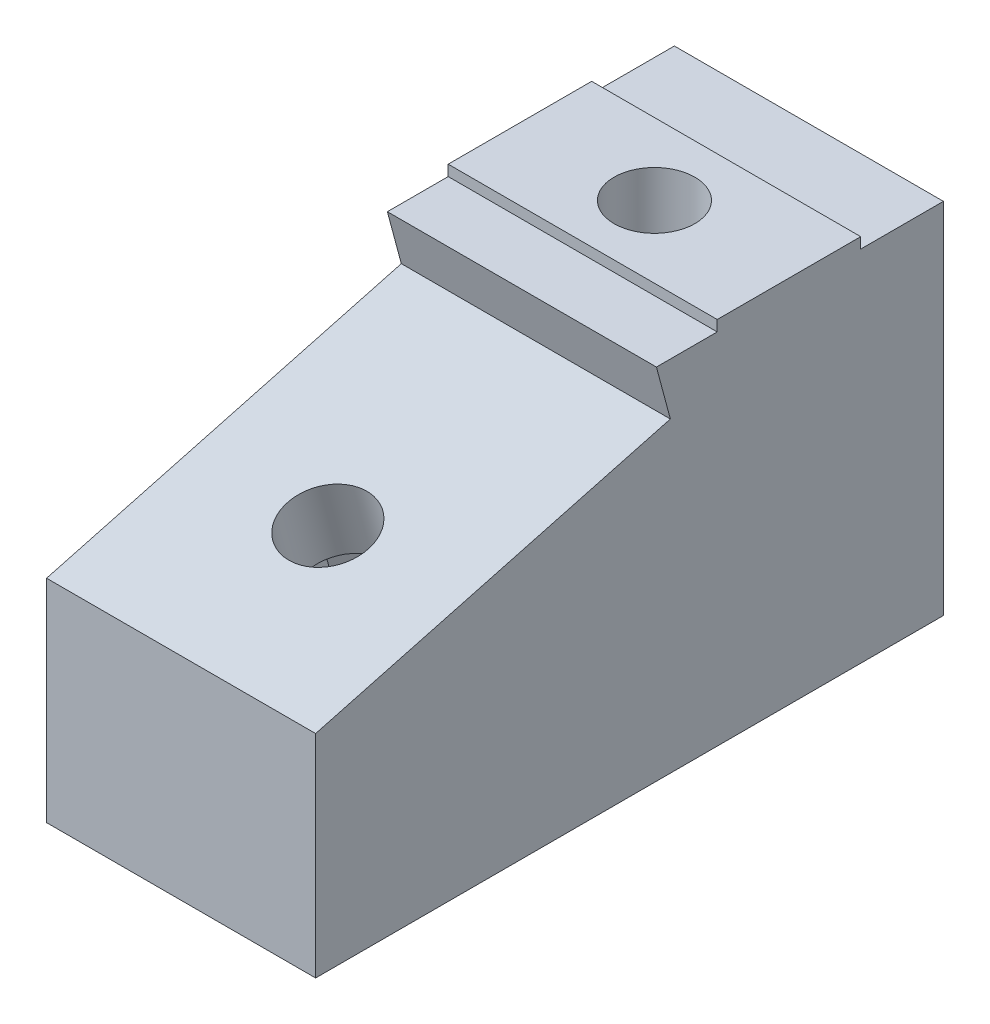
ISO-10303-21;
HEADER;
FILE_DESCRIPTION(('STEP AP214'),'2;1');
FILE_NAME('part.step','',(''),(''),'','','');
FILE_SCHEMA(('AUTOMOTIVE_DESIGN { 1 0 10303 214 1 1 1 1 }'));
ENDSEC;
DATA;
#1=APPLICATION_CONTEXT('core data for automotive mechanical design processes');
#2=APPLICATION_PROTOCOL_DEFINITION('international standard','automotive_design',2000,#1);
#3=PRODUCT_CONTEXT('',#1,'mechanical');
#4=PRODUCT('Part','Part','',(#3));
#5=PRODUCT_RELATED_PRODUCT_CATEGORY('part','',(#4));
#6=PRODUCT_DEFINITION_FORMATION('','',#4);
#7=PRODUCT_DEFINITION_CONTEXT('part definition',#1,'design');
#8=PRODUCT_DEFINITION('design','',#6,#7);
#9=PRODUCT_DEFINITION_SHAPE('','',#8);
#10=(LENGTH_UNIT() NAMED_UNIT(*) SI_UNIT(.MILLI.,.METRE.));
#11=(NAMED_UNIT(*) PLANE_ANGLE_UNIT() SI_UNIT($,.RADIAN.));
#12=(NAMED_UNIT(*) SI_UNIT($,.STERADIAN.) SOLID_ANGLE_UNIT());
#13=UNCERTAINTY_MEASURE_WITH_UNIT(LENGTH_MEASURE(1.E-05),#10,'distance_accuracy_value','');
#14=(GEOMETRIC_REPRESENTATION_CONTEXT(3) GLOBAL_UNCERTAINTY_ASSIGNED_CONTEXT((#13)) GLOBAL_UNIT_ASSIGNED_CONTEXT((#10,
#11,#12)) REPRESENTATION_CONTEXT('',''));
#15=CARTESIAN_POINT('',(0.,0.,0.));
#16=DIRECTION('',(0.,0.,1.));
#17=DIRECTION('',(1.,0.,0.));
#18=AXIS2_PLACEMENT_3D('',#15,#16,#17);
#19=CARTESIAN_POINT('',(0.,0.,-7.39));
#20=DIRECTION('',(0.,-1.,0.));
#21=DIRECTION('',(0.,0.,-1.));
#22=AXIS2_PLACEMENT_3D('',#19,#20,#21);
#23=CYLINDRICAL_SURFACE('',#22,2.25);
#24=CARTESIAN_POINT('',(0.,0.6,-7.39));
#25=DIRECTION('',(0.,1.,0.));
#26=DIRECTION('',(0.,0.,1.));
#27=AXIS2_PLACEMENT_3D('',#24,#25,#26);
#28=CIRCLE('',#27,2.25);
#29=CARTESIAN_POINT('',(0.,0.6,-5.14));
#30=VERTEX_POINT('',#29);
#31=EDGE_CURVE('E392',#30,#30,#28,.T.);
#32=ORIENTED_EDGE('',*,*,#31,.T.);
#33=EDGE_LOOP('',(#32));
#34=FACE_BOUND('',#33,.T.);
#35=CARTESIAN_POINT('',(0.,-12.,-7.39));
#36=DIRECTION('',(0.,-1.,0.));
#37=DIRECTION('',(0.,0.,-1.));
#38=AXIS2_PLACEMENT_3D('',#35,#36,#37);
#39=CIRCLE('',#38,2.25);
#40=CARTESIAN_POINT('',(0.,-12.,-9.64));
#41=VERTEX_POINT('',#40);
#42=EDGE_CURVE('E39',#41,#41,#39,.F.);
#43=ORIENTED_EDGE('',*,*,#42,.F.);
#44=EDGE_LOOP('',(#43));
#45=FACE_BOUND('',#44,.T.);
#46=ADVANCED_FACE('F35',(#34,#45),#23,.F.);
#47=CARTESIAN_POINT('',(7.5,0.,-16.));
#48=DIRECTION('',(0.,-1.,0.));
#49=DIRECTION('',(0.,0.,-1.));
#50=AXIS2_PLACEMENT_3D('',#47,#48,#49);
#51=PLANE('',#50);
#52=DIRECTION('',(-1.,0.,0.));
#53=VECTOR('',#52,1.);
#54=CARTESIAN_POINT('',(-7.5,0.,-11.39));
#55=LINE('',#54,#53);
#56=CARTESIAN_POINT('',(7.5,0.,-11.39));
#57=VERTEX_POINT('',#56);
#58=CARTESIAN_POINT('',(-7.5,0.,-11.39));
#59=VERTEX_POINT('',#58);
#60=EDGE_CURVE('E52',#57,#59,#55,.T.);
#61=ORIENTED_EDGE('',*,*,#60,.F.);
#62=DIRECTION('',(0.,0.,1.));
#63=VECTOR('',#62,1.);
#64=CARTESIAN_POINT('',(7.5,0.,-16.));
#65=LINE('',#64,#63);
#66=CARTESIAN_POINT('',(7.5,0.,-16.));
#67=VERTEX_POINT('',#66);
#68=EDGE_CURVE('E247',#67,#57,#65,.T.);
#69=ORIENTED_EDGE('',*,*,#68,.F.);
#70=DIRECTION('',(-1.,0.,0.));
#71=VECTOR('',#70,1.);
#72=CARTESIAN_POINT('',(7.5,0.,-16.));
#73=LINE('',#72,#71);
#74=CARTESIAN_POINT('',(-7.5,0.,-16.));
#75=VERTEX_POINT('',#74);
#76=EDGE_CURVE('E260',#67,#75,#73,.T.);
#77=ORIENTED_EDGE('',*,*,#76,.T.);
#78=DIRECTION('',(0.,0.,1.));
#79=VECTOR('',#78,1.);
#80=CARTESIAN_POINT('',(-7.5,0.,-16.));
#81=LINE('',#80,#79);
#82=EDGE_CURVE('E231',#75,#59,#81,.T.);
#83=ORIENTED_EDGE('',*,*,#82,.T.);
#84=EDGE_LOOP('',(#61,#69,#77,#83));
#85=FACE_BOUND('',#84,.T.);
#86=ADVANCED_FACE('F329',(#85),#51,.F.);
#87=DIRECTION('',(1.,0.,0.));
#88=VECTOR('',#87,1.);
#89=CARTESIAN_POINT('',(-7.5,0.,-3.39));
#90=LINE('',#89,#88);
#91=CARTESIAN_POINT('',(-7.5,0.,-3.39));
#92=VERTEX_POINT('',#91);
#93=CARTESIAN_POINT('',(7.5,0.,-3.39));
#94=VERTEX_POINT('',#93);
#95=EDGE_CURVE('E60',#92,#94,#90,.T.);
#96=ORIENTED_EDGE('',*,*,#95,.F.);
#97=CARTESIAN_POINT('',(-7.5,0.,0.));
#98=VERTEX_POINT('',#97);
#99=EDGE_CURVE('E174',#92,#98,#81,.T.);
#100=ORIENTED_EDGE('',*,*,#99,.T.);
#101=DIRECTION('',(-1.,0.,0.));
#102=VECTOR('',#101,1.);
#103=CARTESIAN_POINT('',(7.5,0.,0.));
#104=LINE('',#103,#102);
#105=CARTESIAN_POINT('',(7.5,0.,0.));
#106=VERTEX_POINT('',#105);
#107=EDGE_CURVE('E249',#106,#98,#104,.T.);
#108=ORIENTED_EDGE('',*,*,#107,.F.);
#109=EDGE_CURVE('E239',#94,#106,#65,.T.);
#110=ORIENTED_EDGE('',*,*,#109,.F.);
#111=EDGE_LOOP('',(#96,#100,#108,#110));
#112=FACE_BOUND('',#111,.T.);
#113=ADVANCED_FACE('F335',(#112),#51,.F.);
#114=CARTESIAN_POINT('',(7.5,-2.8977774788672,-0.776457135307565));
#115=DIRECTION('',(0.,0.258819045102522,-0.965925826289068));
#116=DIRECTION('',(0.,0.965925826289068,0.258819045102522));
#117=AXIS2_PLACEMENT_3D('',#114,#115,#116);
#118=PLANE('',#117);
#119=DIRECTION('',(0.,-0.965925826289068,-0.258819045102522));
#120=VECTOR('',#119,1.);
#121=CARTESIAN_POINT('',(-7.5,-2.8977774788672,-0.776457135307565));
#122=LINE('',#121,#120);
#123=CARTESIAN_POINT('',(-7.5,-2.8977774788672,-0.776457135307565));
#124=VERTEX_POINT('',#123);
#125=EDGE_CURVE('E226',#98,#124,#122,.T.);
#126=ORIENTED_EDGE('',*,*,#125,.T.);
#127=DIRECTION('',(-1.,0.,0.));
#128=VECTOR('',#127,1.);
#129=CARTESIAN_POINT('',(7.5,-2.8977774788672,-0.776457135307565));
#130=LINE('',#129,#128);
#131=CARTESIAN_POINT('',(7.5,-2.8977774788672,-0.776457135307565));
#132=VERTEX_POINT('',#131);
#133=EDGE_CURVE('E272',#132,#124,#130,.T.);
#134=ORIENTED_EDGE('',*,*,#133,.F.);
#135=DIRECTION('',(0.,-0.965925826289068,-0.258819045102522));
#136=VECTOR('',#135,1.);
#137=CARTESIAN_POINT('',(7.5,-2.8977774788672,-0.776457135307565));
#138=LINE('',#137,#136);
#139=EDGE_CURVE('E227',#106,#132,#138,.T.);
#140=ORIENTED_EDGE('',*,*,#139,.F.);
#141=ORIENTED_EDGE('',*,*,#107,.T.);
#142=EDGE_LOOP('',(#126,#134,#140,#141));
#143=FACE_BOUND('',#142,.T.);
#144=ADVANCED_FACE('F37',(#143),#118,.F.);
#145=CARTESIAN_POINT('',(7.5,-2.8977774788672,-0.776457135307565));
#146=DIRECTION('',(0.,-0.965925826289068,-0.258819045102522));
#147=DIRECTION('',(0.,0.258819045102522,-0.965925826289068));
#148=AXIS2_PLACEMENT_3D('',#145,#146,#147);
#149=PLANE('',#148);
#150=CARTESIAN_POINT('',(0.,-6.0046018463785,10.8183692544376));
#151=DIRECTION('',(0.,0.965925826289068,0.258819045102522));
#152=DIRECTION('',(0.,-0.258819045102522,0.965925826289068));
#153=AXIS2_PLACEMENT_3D('',#150,#151,#152);
#154=CIRCLE('',#153,2.25);
#155=CARTESIAN_POINT('',(0.,-6.58694469785918,12.991702363588));
#156=VERTEX_POINT('',#155);
#157=EDGE_CURVE('E223',#156,#156,#154,.T.);
#158=ORIENTED_EDGE('',*,*,#157,.F.);
#159=EDGE_LOOP('',(#158));
#160=FACE_BOUND('',#159,.T.);
#161=DIRECTION('',(0.,-0.258819045102522,0.965925826289068));
#162=VECTOR('',#161,1.);
#163=CARTESIAN_POINT('',(-7.5,-2.8977774788672,-0.776457135307565));
#164=LINE('',#163,#162);
#165=CARTESIAN_POINT('',(-7.5,-8.1968631974216,19.));
#166=VERTEX_POINT('',#165);
#167=EDGE_CURVE('E372',#124,#166,#164,.T.);
#168=ORIENTED_EDGE('',*,*,#167,.T.);
#169=DIRECTION('',(-1.,0.,0.));
#170=VECTOR('',#169,1.);
#171=CARTESIAN_POINT('',(7.5,-8.1968631974216,19.));
#172=LINE('',#171,#170);
#173=CARTESIAN_POINT('',(7.5,-8.1968631974216,19.));
#174=VERTEX_POINT('',#173);
#175=EDGE_CURVE('E269',#174,#166,#172,.T.);
#176=ORIENTED_EDGE('',*,*,#175,.F.);
#177=DIRECTION('',(0.,-0.258819045102522,0.965925826289068));
#178=VECTOR('',#177,1.);
#179=CARTESIAN_POINT('',(7.5,-2.8977774788672,-0.776457135307565));
#180=LINE('',#179,#178);
#181=EDGE_CURVE('E230',#132,#174,#180,.T.);
#182=ORIENTED_EDGE('',*,*,#181,.F.);
#183=ORIENTED_EDGE('',*,*,#133,.T.);
#184=EDGE_LOOP('',(#168,#176,#182,#183));
#185=FACE_BOUND('',#184,.T.);
#186=ADVANCED_FACE('F361',(#160,#185),#149,.F.);
#187=CARTESIAN_POINT('',(7.5,-8.1968631974216,19.));
#188=DIRECTION('',(0.,0.,-1.));
#189=DIRECTION('',(0.,1.,0.));
#190=AXIS2_PLACEMENT_3D('',#187,#188,#189);
#191=PLANE('',#190);
#192=DIRECTION('',(0.,-1.,0.));
#193=VECTOR('',#192,1.);
#194=CARTESIAN_POINT('',(-7.5,-8.1968631974216,19.));
#195=LINE('',#194,#193);
#196=CARTESIAN_POINT('',(-7.5,-20.,19.));
#197=VERTEX_POINT('',#196);
#198=EDGE_CURVE('E377',#166,#197,#195,.T.);
#199=ORIENTED_EDGE('',*,*,#198,.T.);
#200=DIRECTION('',(-1.,0.,0.));
#201=VECTOR('',#200,1.);
#202=CARTESIAN_POINT('',(7.5,-20.,19.));
#203=LINE('',#202,#201);
#204=CARTESIAN_POINT('',(7.5,-20.,19.));
#205=VERTEX_POINT('',#204);
#206=EDGE_CURVE('E266',#205,#197,#203,.T.);
#207=ORIENTED_EDGE('',*,*,#206,.F.);
#208=DIRECTION('',(0.,-1.,0.));
#209=VECTOR('',#208,1.);
#210=CARTESIAN_POINT('',(7.5,-8.1968631974216,19.));
#211=LINE('',#210,#209);
#212=EDGE_CURVE('E233',#174,#205,#211,.T.);
#213=ORIENTED_EDGE('',*,*,#212,.F.);
#214=ORIENTED_EDGE('',*,*,#175,.T.);
#215=EDGE_LOOP('',(#199,#207,#213,#214));
#216=FACE_BOUND('',#215,.T.);
#217=ADVANCED_FACE('F358',(#216),#191,.F.);
#218=CARTESIAN_POINT('',(7.5,-20.,19.));
#219=DIRECTION('',(0.,1.,0.));
#220=DIRECTION('',(0.,0.,1.));
#221=AXIS2_PLACEMENT_3D('',#218,#219,#220);
#222=PLANE('',#221);
#223=CARTESIAN_POINT('',(0.,-20.,-7.39));
#224=DIRECTION('',(0.,-1.,0.));
#225=DIRECTION('',(0.,0.,-1.));
#226=AXIS2_PLACEMENT_3D('',#223,#224,#225);
#227=CIRCLE('',#226,5.);
#228=CARTESIAN_POINT('',(0.,-20.,-12.39));
#229=VERTEX_POINT('',#228);
#230=EDGE_CURVE('E394',#229,#229,#227,.T.);
#231=ORIENTED_EDGE('',*,*,#230,.F.);
#232=EDGE_LOOP('',(#231));
#233=FACE_BOUND('',#232,.T.);
#234=DIRECTION('',(0.,0.,1.));
#235=VECTOR('',#234,1.);
#236=CARTESIAN_POINT('',(-3.55,-20.,19.));
#237=LINE('',#236,#235);
#238=CARTESIAN_POINT('',(-3.54999999999999,-20.,4.94641833729162));
#239=VERTEX_POINT('',#238);
#240=CARTESIAN_POINT('',(-3.55,-20.,9.19020890555374));
#241=VERTEX_POINT('',#240);
#242=EDGE_CURVE('E44',#239,#241,#237,.T.);
#243=ORIENTED_EDGE('',*,*,#242,.T.);
#244=DIRECTION('',(0.858356263574049,0.,0.513054114868206));
#245=VECTOR('',#244,1.);
#246=CARTESIAN_POINT('',(8.9114363226629,-20.,16.6386210088095));
#247=LINE('',#246,#245);
#248=CARTESIAN_POINT('',(0.,-20.,11.3121041896848));
#249=VERTEX_POINT('',#248);
#250=EDGE_CURVE('E12',#241,#249,#247,.T.);
#251=ORIENTED_EDGE('',*,*,#250,.T.);
#252=DIRECTION('',(0.858356263574048,0.,-0.513054114868206));
#253=VECTOR('',#252,1.);
#254=CARTESIAN_POINT('',(2.14019580558912,-20.,10.032872813066));
#255=LINE('',#254,#253);
#256=CARTESIAN_POINT('',(3.55,-20.,9.19020890555374));
#257=VERTEX_POINT('',#256);
#258=EDGE_CURVE('E275',#249,#257,#255,.T.);
#259=ORIENTED_EDGE('',*,*,#258,.T.);
#260=DIRECTION('',(0.,0.,-1.));
#261=VECTOR('',#260,1.);
#262=CARTESIAN_POINT('',(3.55,-20.,19.));
#263=LINE('',#262,#261);
#264=CARTESIAN_POINT('',(3.55,-20.,4.94641833729162));
#265=VERTEX_POINT('',#264);
#266=EDGE_CURVE('E280',#257,#265,#263,.T.);
#267=ORIENTED_EDGE('',*,*,#266,.T.);
#268=DIRECTION('',(-0.858356263574049,0.,-0.513054114868206));
#269=VECTOR('',#268,1.);
#270=CARTESIAN_POINT('',(12.6492245745843,-20.,10.3851793835057));
#271=LINE('',#270,#269);
#272=CARTESIAN_POINT('',(0.,-20.,2.82452305316056));
#273=VERTEX_POINT('',#272);
#274=EDGE_CURVE('E283',#265,#273,#271,.T.);
#275=ORIENTED_EDGE('',*,*,#274,.T.);
#276=DIRECTION('',(-0.858356263574049,0.,0.513054114868206));
#277=VECTOR('',#276,1.);
#278=CARTESIAN_POINT('',(-1.59759244633229,-20.,3.77943118776222));
#279=LINE('',#278,#277);
#280=EDGE_CURVE('E286',#273,#239,#279,.T.);
#281=ORIENTED_EDGE('',*,*,#280,.T.);
#282=EDGE_LOOP('',(#243,#251,#259,#267,#275,#281));
#283=FACE_BOUND('',#282,.T.);
#284=DIRECTION('',(0.,0.,-1.));
#285=VECTOR('',#284,1.);
#286=CARTESIAN_POINT('',(-7.5,-20.,19.));
#287=LINE('',#286,#285);
#288=CARTESIAN_POINT('',(-7.5,-20.,-16.));
#289=VERTEX_POINT('',#288);
#290=EDGE_CURVE('E381',#197,#289,#287,.T.);
#291=ORIENTED_EDGE('',*,*,#290,.T.);
#292=DIRECTION('',(-1.,0.,0.));
#293=VECTOR('',#292,1.);
#294=CARTESIAN_POINT('',(7.5,-20.,-16.));
#295=LINE('',#294,#293);
#296=CARTESIAN_POINT('',(7.5,-20.,-16.));
#297=VERTEX_POINT('',#296);
#298=EDGE_CURVE('E263',#297,#289,#295,.T.);
#299=ORIENTED_EDGE('',*,*,#298,.F.);
#300=DIRECTION('',(0.,0.,-1.));
#301=VECTOR('',#300,1.);
#302=CARTESIAN_POINT('',(7.5,-20.,19.));
#303=LINE('',#302,#301);
#304=EDGE_CURVE('E235',#205,#297,#303,.T.);
#305=ORIENTED_EDGE('',*,*,#304,.F.);
#306=ORIENTED_EDGE('',*,*,#206,.T.);
#307=EDGE_LOOP('',(#291,#299,#305,#306));
#308=FACE_BOUND('',#307,.T.);
#309=ADVANCED_FACE('F291',(#233,#283,#308),#222,.F.);
#310=CARTESIAN_POINT('',(7.5,-20.,-16.));
#311=DIRECTION('',(0.,0.,1.));
#312=DIRECTION('',(1.,0.,0.));
#313=AXIS2_PLACEMENT_3D('',#310,#311,#312);
#314=PLANE('',#313);
#315=DIRECTION('',(0.,1.,0.));
#316=VECTOR('',#315,1.);
#317=CARTESIAN_POINT('',(-7.5,-20.,-16.));
#318=LINE('',#317,#316);
#319=EDGE_CURVE('E252',#289,#75,#318,.T.);
#320=ORIENTED_EDGE('',*,*,#319,.T.);
#321=ORIENTED_EDGE('',*,*,#76,.F.);
#322=DIRECTION('',(0.,1.,0.));
#323=VECTOR('',#322,1.);
#324=CARTESIAN_POINT('',(7.5,-20.,-16.));
#325=LINE('',#324,#323);
#326=EDGE_CURVE('E237',#297,#67,#325,.T.);
#327=ORIENTED_EDGE('',*,*,#326,.F.);
#328=ORIENTED_EDGE('',*,*,#298,.T.);
#329=EDGE_LOOP('',(#320,#321,#327,#328));
#330=FACE_BOUND('',#329,.T.);
#331=ADVANCED_FACE('F349',(#330),#314,.F.);
#332=CARTESIAN_POINT('',(7.5,0.,0.));
#333=DIRECTION('',(1.,0.,0.));
#334=DIRECTION('',(0.,0.,-1.));
#335=AXIS2_PLACEMENT_3D('',#332,#333,#334);
#336=PLANE('',#335);
#337=ORIENTED_EDGE('',*,*,#139,.T.);
#338=ORIENTED_EDGE('',*,*,#181,.T.);
#339=ORIENTED_EDGE('',*,*,#212,.T.);
#340=ORIENTED_EDGE('',*,*,#304,.T.);
#341=ORIENTED_EDGE('',*,*,#326,.T.);
#342=ORIENTED_EDGE('',*,*,#68,.T.);
#343=DIRECTION('',(0.,-1.,0.));
#344=VECTOR('',#343,1.);
#345=CARTESIAN_POINT('',(7.5,0.6,-11.39));
#346=LINE('',#345,#344);
#347=CARTESIAN_POINT('',(7.5,0.6,-11.39));
#348=VERTEX_POINT('',#347);
#349=EDGE_CURVE('E180',#348,#57,#346,.T.);
#350=ORIENTED_EDGE('',*,*,#349,.F.);
#351=DIRECTION('',(0.,0.,-1.));
#352=VECTOR('',#351,1.);
#353=CARTESIAN_POINT('',(7.5,0.6,-11.39));
#354=LINE('',#353,#352);
#355=CARTESIAN_POINT('',(7.5,0.6,-3.39));
#356=VERTEX_POINT('',#355);
#357=EDGE_CURVE('E160',#356,#348,#354,.T.);
#358=ORIENTED_EDGE('',*,*,#357,.F.);
#359=DIRECTION('',(0.,-1.,0.));
#360=VECTOR('',#359,1.);
#361=CARTESIAN_POINT('',(7.5,0.6,-3.39));
#362=LINE('',#361,#360);
#363=EDGE_CURVE('E157',#356,#94,#362,.T.);
#364=ORIENTED_EDGE('',*,*,#363,.T.);
#365=ORIENTED_EDGE('',*,*,#109,.T.);
#366=EDGE_LOOP('',(#337,#338,#339,#340,#341,#342,#350,#358,#364,#365));
#367=FACE_BOUND('',#366,.T.);
#368=ADVANCED_FACE('F346',(#367),#336,.T.);
#369=CARTESIAN_POINT('',(-7.5,0.,0.));
#370=DIRECTION('',(1.,0.,0.));
#371=DIRECTION('',(0.,0.,-1.));
#372=AXIS2_PLACEMENT_3D('',#369,#370,#371);
#373=PLANE('',#372);
#374=ORIENTED_EDGE('',*,*,#125,.F.);
#375=ORIENTED_EDGE('',*,*,#99,.F.);
#376=DIRECTION('',(0.,-1.,0.));
#377=VECTOR('',#376,1.);
#378=CARTESIAN_POINT('',(-7.5,0.6,-3.39));
#379=LINE('',#378,#377);
#380=CARTESIAN_POINT('',(-7.5,0.6,-3.39));
#381=VERTEX_POINT('',#380);
#382=EDGE_CURVE('E155',#381,#92,#379,.T.);
#383=ORIENTED_EDGE('',*,*,#382,.F.);
#384=DIRECTION('',(0.,0.,1.));
#385=VECTOR('',#384,1.);
#386=CARTESIAN_POINT('',(-7.5,0.6,-11.39));
#387=LINE('',#386,#385);
#388=CARTESIAN_POINT('',(-7.5,0.6,-11.39));
#389=VERTEX_POINT('',#388);
#390=EDGE_CURVE('E161',#389,#381,#387,.T.);
#391=ORIENTED_EDGE('',*,*,#390,.F.);
#392=DIRECTION('',(0.,-1.,0.));
#393=VECTOR('',#392,1.);
#394=CARTESIAN_POINT('',(-7.5,0.6,-11.39));
#395=LINE('',#394,#393);
#396=EDGE_CURVE('E189',#389,#59,#395,.T.);
#397=ORIENTED_EDGE('',*,*,#396,.T.);
#398=ORIENTED_EDGE('',*,*,#82,.F.);
#399=ORIENTED_EDGE('',*,*,#319,.F.);
#400=ORIENTED_EDGE('',*,*,#290,.F.);
#401=ORIENTED_EDGE('',*,*,#198,.F.);
#402=ORIENTED_EDGE('',*,*,#167,.F.);
#403=EDGE_LOOP('',(#374,#375,#383,#391,#397,#398,#399,#400,#401,#402));
#404=FACE_BOUND('',#403,.T.);
#405=ADVANCED_FACE('F173',(#404),#373,.F.);
#406=CARTESIAN_POINT('',(0.,-25.7670784053557,5.52302962002065));
#407=DIRECTION('',(0.,0.965925826289068,0.258819045102522));
#408=DIRECTION('',(0.,-0.258819045102522,0.965925826289068));
#409=AXIS2_PLACEMENT_3D('',#406,#407,#408);
#410=CYLINDRICAL_SURFACE('',#409,2.25);
#411=CARTESIAN_POINT('',(0.,-9.86830515153477,9.78309307402751));
#412=DIRECTION('',(0.,0.965925826289068,0.258819045102522));
#413=DIRECTION('',(0.,-0.258819045102522,0.965925826289068));
#414=AXIS2_PLACEMENT_3D('',#411,#412,#413);
#415=CIRCLE('',#414,2.25);
#416=CARTESIAN_POINT('',(0.,-10.4506480030154,11.9564261831779));
#417=VERTEX_POINT('',#416);
#418=EDGE_CURVE('E213',#417,#417,#415,.F.);
#419=ORIENTED_EDGE('',*,*,#418,.T.);
#420=EDGE_LOOP('',(#419));
#421=FACE_BOUND('',#420,.T.);
#422=ORIENTED_EDGE('',*,*,#157,.T.);
#423=EDGE_LOOP('',(#422));
#424=FACE_BOUND('',#423,.T.);
#425=ADVANCED_FACE('F342',(#421,#424),#410,.F.);
#426=CARTESIAN_POINT('',(-3.55,-26.2975522263885,7.50278487220013));
#427=DIRECTION('',(-0.5,-0.224143868042014,0.836516303737808));
#428=DIRECTION('',(0.858356263574049,0.,0.513054114868206));
#429=AXIS2_PLACEMENT_3D('',#426,#427,#428);
#430=PLANE('',#429);
#431=DIRECTION('',(0.,0.965925826289068,0.258819045102522));
#432=VECTOR('',#431,1.);
#433=CARTESIAN_POINT('',(-3.55,-26.2975522263885,7.50278487220013));
#434=LINE('',#433,#432);
#435=CARTESIAN_POINT('',(-3.55,-10.3987789725675,11.762848326207));
#436=VERTEX_POINT('',#435);
#437=EDGE_CURVE('E211',#241,#436,#434,.T.);
#438=ORIENTED_EDGE('',*,*,#437,.T.);
#439=DIRECTION('',(0.866025403784439,-0.129409522551261,0.482962913144534));
#440=VECTOR('',#439,1.);
#441=CARTESIAN_POINT('',(-3.55,-10.3987789725675,11.762848326207));
#442=LINE('',#441,#440);
#443=CARTESIAN_POINT('',(0.,-10.9292527936003,13.7426035783865));
#444=VERTEX_POINT('',#443);
#445=EDGE_CURVE('E175',#436,#444,#442,.T.);
#446=ORIENTED_EDGE('',*,*,#445,.T.);
#447=DIRECTION('',(0.,0.965925826289068,0.258819045102522));
#448=VECTOR('',#447,1.);
#449=CARTESIAN_POINT('',(0.,-26.8280260474212,9.48254012437961));
#450=LINE('',#449,#448);
#451=EDGE_CURVE('E210',#249,#444,#450,.T.);
#452=ORIENTED_EDGE('',*,*,#451,.F.);
#453=ORIENTED_EDGE('',*,*,#250,.F.);
#454=EDGE_LOOP('',(#438,#446,#452,#453));
#455=FACE_BOUND('',#454,.T.);
#456=ADVANCED_FACE('F311',(#455),#430,.F.);
#457=CARTESIAN_POINT('',(-3.55,-25.2366045843229,3.54327436784117));
#458=DIRECTION('',(-1.,0.,0.));
#459=DIRECTION('',(0.,0.,1.));
#460=AXIS2_PLACEMENT_3D('',#457,#458,#459);
#461=PLANE('',#460);
#462=DIRECTION('',(0.,0.965925826289068,0.258819045102522));
#463=VECTOR('',#462,1.);
#464=CARTESIAN_POINT('',(-3.55,-25.2366045843229,3.54327436784117));
#465=LINE('',#464,#463);
#466=CARTESIAN_POINT('',(-3.55,-9.33783133050201,7.80333782184803));
#467=VERTEX_POINT('',#466);
#468=EDGE_CURVE('E214',#239,#467,#465,.T.);
#469=ORIENTED_EDGE('',*,*,#468,.T.);
#470=DIRECTION('',(0.,-0.258819045102522,0.965925826289068));
#471=VECTOR('',#470,1.);
#472=CARTESIAN_POINT('',(-3.55,-9.33783133050201,7.80333782184803));
#473=LINE('',#472,#471);
#474=EDGE_CURVE('E207',#467,#436,#473,.T.);
#475=ORIENTED_EDGE('',*,*,#474,.T.);
#476=ORIENTED_EDGE('',*,*,#437,.F.);
#477=ORIENTED_EDGE('',*,*,#242,.F.);
#478=EDGE_LOOP('',(#469,#475,#476,#477));
#479=FACE_BOUND('',#478,.T.);
#480=ADVANCED_FACE('F296',(#479),#461,.F.);
#481=CARTESIAN_POINT('',(0.,-24.7061307632902,1.5635191156617));
#482=DIRECTION('',(-0.5,0.224143868042014,-0.836516303737808));
#483=DIRECTION('',(-0.858356263574049,0.,0.513054114868206));
#484=AXIS2_PLACEMENT_3D('',#481,#482,#483);
#485=PLANE('',#484);
#486=DIRECTION('',(0.,0.965925826289068,0.258819045102522));
#487=VECTOR('',#486,1.);
#488=CARTESIAN_POINT('',(0.,-24.7061307632902,1.5635191156617));
#489=LINE('',#488,#487);
#490=CARTESIAN_POINT('',(0.,-8.80735750946924,5.82358256966856));
#491=VERTEX_POINT('',#490);
#492=EDGE_CURVE('E216',#273,#491,#489,.T.);
#493=ORIENTED_EDGE('',*,*,#492,.T.);
#494=DIRECTION('',(-0.866025403784439,-0.129409522551261,0.482962913144534));
#495=VECTOR('',#494,1.);
#496=CARTESIAN_POINT('',(0.,-8.80735750946924,5.82358256966856));
#497=LINE('',#496,#495);
#498=EDGE_CURVE('E204',#491,#467,#497,.T.);
#499=ORIENTED_EDGE('',*,*,#498,.T.);
#500=ORIENTED_EDGE('',*,*,#468,.F.);
#501=ORIENTED_EDGE('',*,*,#280,.F.);
#502=EDGE_LOOP('',(#493,#499,#500,#501));
#503=FACE_BOUND('',#502,.T.);
#504=ADVANCED_FACE('F298',(#503),#485,.F.);
#505=CARTESIAN_POINT('',(3.55,-25.2366045843229,3.54327436784117));
#506=DIRECTION('',(0.5,0.224143868042014,-0.836516303737808));
#507=DIRECTION('',(-0.858356263574049,0.,-0.513054114868206));
#508=AXIS2_PLACEMENT_3D('',#505,#506,#507);
#509=PLANE('',#508);
#510=DIRECTION('',(0.,0.965925826289068,0.258819045102522));
#511=VECTOR('',#510,1.);
#512=CARTESIAN_POINT('',(3.55,-25.2366045843229,3.54327436784117));
#513=LINE('',#512,#511);
#514=CARTESIAN_POINT('',(3.55,-9.33783133050201,7.80333782184804));
#515=VERTEX_POINT('',#514);
#516=EDGE_CURVE('E218',#265,#515,#513,.T.);
#517=ORIENTED_EDGE('',*,*,#516,.T.);
#518=DIRECTION('',(-0.866025403784439,0.129409522551261,-0.482962913144534));
#519=VECTOR('',#518,1.);
#520=CARTESIAN_POINT('',(3.55,-9.33783133050201,7.80333782184804));
#521=LINE('',#520,#519);
#522=EDGE_CURVE('E201',#515,#491,#521,.T.);
#523=ORIENTED_EDGE('',*,*,#522,.T.);
#524=ORIENTED_EDGE('',*,*,#492,.F.);
#525=ORIENTED_EDGE('',*,*,#274,.F.);
#526=EDGE_LOOP('',(#517,#523,#524,#525));
#527=FACE_BOUND('',#526,.T.);
#528=ADVANCED_FACE('F319',(#527),#509,.F.);
#529=CARTESIAN_POINT('',(3.55,-26.2975522263885,7.50278487220013));
#530=DIRECTION('',(1.,0.,0.));
#531=DIRECTION('',(0.,0.,-1.));
#532=AXIS2_PLACEMENT_3D('',#529,#530,#531);
#533=PLANE('',#532);
#534=DIRECTION('',(0.,0.965925826289068,0.258819045102522));
#535=VECTOR('',#534,1.);
#536=CARTESIAN_POINT('',(3.55,-26.2975522263885,7.50278487220013));
#537=LINE('',#536,#535);
#538=CARTESIAN_POINT('',(3.55,-10.3987789725675,11.762848326207));
#539=VERTEX_POINT('',#538);
#540=EDGE_CURVE('E220',#257,#539,#537,.T.);
#541=ORIENTED_EDGE('',*,*,#540,.T.);
#542=DIRECTION('',(0.,0.258819045102522,-0.965925826289068));
#543=VECTOR('',#542,1.);
#544=CARTESIAN_POINT('',(3.55,-10.3987789725675,11.762848326207));
#545=LINE('',#544,#543);
#546=EDGE_CURVE('E198',#539,#515,#545,.T.);
#547=ORIENTED_EDGE('',*,*,#546,.T.);
#548=ORIENTED_EDGE('',*,*,#516,.F.);
#549=ORIENTED_EDGE('',*,*,#266,.F.);
#550=EDGE_LOOP('',(#541,#547,#548,#549));
#551=FACE_BOUND('',#550,.T.);
#552=ADVANCED_FACE('F317',(#551),#533,.F.);
#553=CARTESIAN_POINT('',(0.,-26.8280260474212,9.48254012437961));
#554=DIRECTION('',(0.5,-0.224143868042014,0.836516303737807));
#555=DIRECTION('',(0.858356263574048,0.,-0.513054114868206));
#556=AXIS2_PLACEMENT_3D('',#553,#554,#555);
#557=PLANE('',#556);
#558=ORIENTED_EDGE('',*,*,#451,.T.);
#559=DIRECTION('',(0.866025403784438,0.129409522551261,-0.482962913144534));
#560=VECTOR('',#559,1.);
#561=CARTESIAN_POINT('',(0.,-10.9292527936003,13.7426035783865));
#562=LINE('',#561,#560);
#563=EDGE_CURVE('E178',#444,#539,#562,.T.);
#564=ORIENTED_EDGE('',*,*,#563,.T.);
#565=ORIENTED_EDGE('',*,*,#540,.F.);
#566=ORIENTED_EDGE('',*,*,#258,.F.);
#567=EDGE_LOOP('',(#558,#564,#565,#566));
#568=FACE_BOUND('',#567,.T.);
#569=ADVANCED_FACE('F313',(#568),#557,.F.);
#570=CARTESIAN_POINT('',(0.,-6.76148078402348,-1.81173331571765));
#571=DIRECTION('',(0.,0.965925826289068,0.258819045102522));
#572=DIRECTION('',(0.,-0.258819045102522,0.965925826289068));
#573=AXIS2_PLACEMENT_3D('',#570,#571,#572);
#574=PLANE('',#573);
#575=ORIENTED_EDGE('',*,*,#445,.F.);
#576=ORIENTED_EDGE('',*,*,#474,.F.);
#577=ORIENTED_EDGE('',*,*,#498,.F.);
#578=ORIENTED_EDGE('',*,*,#522,.F.);
#579=ORIENTED_EDGE('',*,*,#546,.F.);
#580=ORIENTED_EDGE('',*,*,#563,.F.);
#581=EDGE_LOOP('',(#575,#576,#577,#578,#579,#580));
#582=FACE_BOUND('',#581,.T.);
#583=ORIENTED_EDGE('',*,*,#418,.F.);
#584=EDGE_LOOP('',(#583));
#585=FACE_BOUND('',#584,.T.);
#586=ADVANCED_FACE('F305',(#582,#585),#574,.F.);
#587=CARTESIAN_POINT('',(0.,0.6,0.));
#588=DIRECTION('',(0.,1.,0.));
#589=DIRECTION('',(0.,0.,1.));
#590=AXIS2_PLACEMENT_3D('',#587,#588,#589);
#591=PLANE('',#590);
#592=ORIENTED_EDGE('',*,*,#390,.T.);
#593=DIRECTION('',(1.,0.,0.));
#594=VECTOR('',#593,1.);
#595=CARTESIAN_POINT('',(-7.5,0.6,-3.39));
#596=LINE('',#595,#594);
#597=EDGE_CURVE('E151',#381,#356,#596,.T.);
#598=ORIENTED_EDGE('',*,*,#597,.T.);
#599=ORIENTED_EDGE('',*,*,#357,.T.);
#600=DIRECTION('',(-1.,0.,0.));
#601=VECTOR('',#600,1.);
#602=CARTESIAN_POINT('',(-7.5,0.6,-11.39));
#603=LINE('',#602,#601);
#604=EDGE_CURVE('E167',#348,#389,#603,.T.);
#605=ORIENTED_EDGE('',*,*,#604,.T.);
#606=EDGE_LOOP('',(#592,#598,#599,#605));
#607=FACE_BOUND('',#606,.T.);
#608=ORIENTED_EDGE('',*,*,#31,.F.);
#609=EDGE_LOOP('',(#608));
#610=FACE_BOUND('',#609,.T.);
#611=ADVANCED_FACE('F164',(#607,#610),#591,.T.);
#612=CARTESIAN_POINT('',(-7.5,0.6,-3.39));
#613=DIRECTION('',(0.,0.,-1.));
#614=DIRECTION('',(0.,1.,0.));
#615=AXIS2_PLACEMENT_3D('',#612,#613,#614);
#616=PLANE('',#615);
#617=ORIENTED_EDGE('',*,*,#95,.T.);
#618=ORIENTED_EDGE('',*,*,#363,.F.);
#619=ORIENTED_EDGE('',*,*,#597,.F.);
#620=ORIENTED_EDGE('',*,*,#382,.T.);
#621=EDGE_LOOP('',(#617,#618,#619,#620));
#622=FACE_BOUND('',#621,.T.);
#623=ADVANCED_FACE('F153',(#622),#616,.F.);
#624=CARTESIAN_POINT('',(-7.5,0.6,-11.39));
#625=DIRECTION('',(0.,0.,1.));
#626=DIRECTION('',(0.,-1.,0.));
#627=AXIS2_PLACEMENT_3D('',#624,#625,#626);
#628=PLANE('',#627);
#629=ORIENTED_EDGE('',*,*,#60,.T.);
#630=ORIENTED_EDGE('',*,*,#396,.F.);
#631=ORIENTED_EDGE('',*,*,#604,.F.);
#632=ORIENTED_EDGE('',*,*,#349,.T.);
#633=EDGE_LOOP('',(#629,#630,#631,#632));
#634=FACE_BOUND('',#633,.T.);
#635=ADVANCED_FACE('F407',(#634),#628,.F.);
#636=CARTESIAN_POINT('',(0.,-12.,-7.39));
#637=DIRECTION('',(0.,-1.,0.));
#638=DIRECTION('',(0.,0.,-1.));
#639=AXIS2_PLACEMENT_3D('',#636,#637,#638);
#640=PLANE('',#639);
#641=CARTESIAN_POINT('',(0.,-12.,-7.39));
#642=DIRECTION('',(0.,-1.,0.));
#643=DIRECTION('',(0.,0.,-1.));
#644=AXIS2_PLACEMENT_3D('',#641,#642,#643);
#645=CIRCLE('',#644,5.);
#646=CARTESIAN_POINT('',(0.,-12.,-12.39));
#647=VERTEX_POINT('',#646);
#648=EDGE_CURVE('E397',#647,#647,#645,.T.);
#649=ORIENTED_EDGE('',*,*,#648,.T.);
#650=EDGE_LOOP('',(#649));
#651=FACE_BOUND('',#650,.T.);
#652=ORIENTED_EDGE('',*,*,#42,.T.);
#653=EDGE_LOOP('',(#652));
#654=FACE_BOUND('',#653,.T.);
#655=ADVANCED_FACE('F404',(#651,#654),#640,.T.);
#656=CARTESIAN_POINT('',(0.,-12.,-7.39));
#657=DIRECTION('',(0.,-1.,0.));
#658=DIRECTION('',(0.,0.,-1.));
#659=AXIS2_PLACEMENT_3D('',#656,#657,#658);
#660=CYLINDRICAL_SURFACE('',#659,5.);
#661=ORIENTED_EDGE('',*,*,#648,.F.);
#662=EDGE_LOOP('',(#661));
#663=FACE_BOUND('',#662,.T.);
#664=ORIENTED_EDGE('',*,*,#230,.T.);
#665=EDGE_LOOP('',(#664));
#666=FACE_BOUND('',#665,.T.);
#667=ADVANCED_FACE('F406',(#663,#666),#660,.F.);
#668=CLOSED_SHELL('',(#46,#86,#113,#144,#186,#217,#309,#331,#368,#405,#425,#456,#480,#504,#528,
#552,#569,#586,#611,#623,#635,#655,#667));
#669=MANIFOLD_SOLID_BREP('B2',#668);
#670=ADVANCED_BREP_SHAPE_REPRESENTATION('',(#18,#669),#14);
#671=SHAPE_DEFINITION_REPRESENTATION(#9,#670);
ENDSEC;
END-ISO-10303-21;
